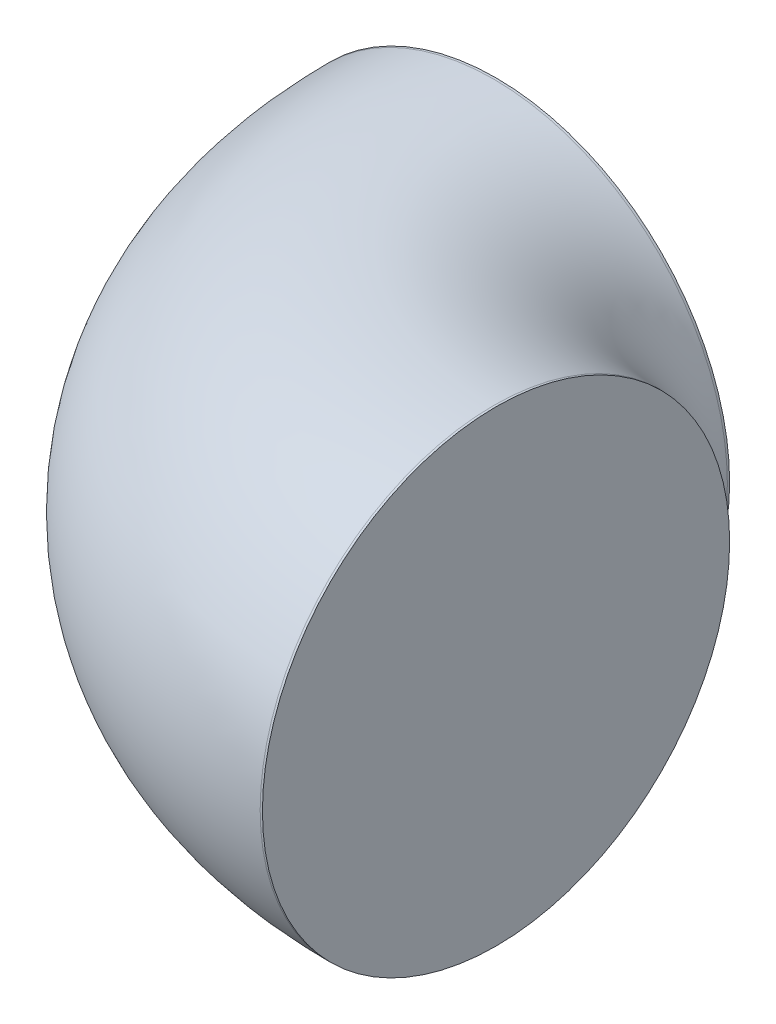
ISO-10303-21;
HEADER;
FILE_DESCRIPTION(('STEP AP214'),'2;1');
FILE_NAME('part.step','',(''),(''),'','','');
FILE_SCHEMA(('AUTOMOTIVE_DESIGN { 1 0 10303 214 1 1 1 1 }'));
ENDSEC;
DATA;
#1=APPLICATION_CONTEXT('core data for automotive mechanical design processes');
#2=APPLICATION_PROTOCOL_DEFINITION('international standard','automotive_design',2000,#1);
#3=PRODUCT_CONTEXT('',#1,'mechanical');
#4=PRODUCT('Part','Part','',(#3));
#5=PRODUCT_RELATED_PRODUCT_CATEGORY('part','',(#4));
#6=PRODUCT_DEFINITION_FORMATION('','',#4);
#7=PRODUCT_DEFINITION_CONTEXT('part definition',#1,'design');
#8=PRODUCT_DEFINITION('design','',#6,#7);
#9=PRODUCT_DEFINITION_SHAPE('','',#8);
#10=(LENGTH_UNIT() NAMED_UNIT(*) SI_UNIT(.MILLI.,.METRE.));
#11=(NAMED_UNIT(*) PLANE_ANGLE_UNIT() SI_UNIT($,.RADIAN.));
#12=(NAMED_UNIT(*) SI_UNIT($,.STERADIAN.) SOLID_ANGLE_UNIT());
#13=UNCERTAINTY_MEASURE_WITH_UNIT(LENGTH_MEASURE(1.E-05),#10,'distance_accuracy_value','');
#14=(GEOMETRIC_REPRESENTATION_CONTEXT(3) GLOBAL_UNCERTAINTY_ASSIGNED_CONTEXT((#13)) GLOBAL_UNIT_ASSIGNED_CONTEXT((#10,
#11,#12)) REPRESENTATION_CONTEXT('',''));
#15=CARTESIAN_POINT('',(0.,0.,0.));
#16=DIRECTION('',(0.,0.,1.));
#17=DIRECTION('',(1.,0.,0.));
#18=AXIS2_PLACEMENT_3D('',#15,#16,#17);
#19=CARTESIAN_POINT('',(-58.0614095716506,0.,-23.2688918307732));
#20=DIRECTION('',(0.,0.,-1.));
#21=DIRECTION('',(-1.,0.,0.));
#22=AXIS2_PLACEMENT_3D('',#19,#20,#21);
#23=PLANE('',#22);
#24=CARTESIAN_POINT('',(-58.0614095716506,0.,-23.2688918307732));
#25=DIRECTION('',(0.,0.,-1.));
#26=DIRECTION('',(-1.,0.,0.));
#27=AXIS2_PLACEMENT_3D('',#24,#25,#26);
#28=CIRCLE('',#27,26.25);
#29=CARTESIAN_POINT('',(-84.3114095716506,0.,-23.2688918307752));
#30=VERTEX_POINT('',#29);
#31=EDGE_CURVE('E57',#30,#30,#28,.T.);
#32=ORIENTED_EDGE('',*,*,#31,.T.);
#33=EDGE_LOOP('',(#32));
#34=FACE_BOUND('',#33,.T.);
#35=ADVANCED_FACE('F45',(#34),#23,.T.);
#36=CARTESIAN_POINT('',(-26.0574095716506,0.,8.73510816922678));
#37=DIRECTION('',(-1.,0.,0.));
#38=DIRECTION('',(0.,0.,1.));
#39=AXIS2_PLACEMENT_3D('',#36,#37,#38);
#40=PLANE('',#39);
#41=CARTESIAN_POINT('',(-26.0574095716506,0.,8.73510816922678));
#42=DIRECTION('',(-1.,0.,0.));
#43=DIRECTION('',(0.,0.,1.));
#44=AXIS2_PLACEMENT_3D('',#41,#42,#43);
#45=CIRCLE('',#44,26.25);
#46=CARTESIAN_POINT('',(-26.0574095716512,0.,34.9851081692268));
#47=VERTEX_POINT('',#46);
#48=EDGE_CURVE('E12',#47,#47,#45,.T.);
#49=ORIENTED_EDGE('',*,*,#48,.F.);
#50=EDGE_LOOP('',(#49));
#51=FACE_BOUND('',#50,.T.);
#52=ADVANCED_FACE('F63',(#51),#40,.F.);
#53=CARTESIAN_POINT('',(-58.0614095716506,0.,-23.2688918307732));
#54=DIRECTION('',(0.,0.,1.));
#55=DIRECTION('',(1.,0.,0.));
#56=AXIS2_PLACEMENT_3D('',#53,#54,#55);
#57=CYLINDRICAL_SURFACE('',#56,26.25);
#58=CARTESIAN_POINT('',(-58.0614095716507,0.,-23.0148918307732));
#59=DIRECTION('',(0.,0.,-1.));
#60=DIRECTION('',(-1.,0.,0.));
#61=AXIS2_PLACEMENT_3D('',#58,#59,#60);
#62=CIRCLE('',#61,26.25);
#63=CARTESIAN_POINT('',(-84.3114095716506,0.,-23.0148918307732));
#64=VERTEX_POINT('',#63);
#65=EDGE_CURVE('E88',#64,#64,#62,.T.);
#66=ORIENTED_EDGE('',*,*,#65,.T.);
#67=EDGE_LOOP('',(#66));
#68=FACE_BOUND('',#67,.T.);
#69=ORIENTED_EDGE('',*,*,#31,.F.);
#70=EDGE_LOOP('',(#69));
#71=FACE_BOUND('',#70,.T.);
#72=ADVANCED_FACE('F65',(#68,#71),#57,.T.);
#73=CARTESIAN_POINT('',(-26.3114095716506,0.,-23.0148918307732));
#74=DIRECTION('',(0.,1.,0.));
#75=DIRECTION('',(0.,0.,1.));
#76=AXIS2_PLACEMENT_3D('',#73,#74,#75);
#77=TOROIDAL_SURFACE('',#76,31.75,26.25);
#78=CARTESIAN_POINT('',(-26.3114095716509,0.,8.73510816922607));
#79=DIRECTION('',(-1.,0.,0.));
#80=DIRECTION('',(0.,0.,1.));
#81=AXIS2_PLACEMENT_3D('',#78,#79,#80);
#82=CIRCLE('',#81,26.25);
#83=CARTESIAN_POINT('',(-26.3114095716511,0.,34.9851081692268));
#84=VERTEX_POINT('',#83);
#85=EDGE_CURVE('E52',#84,#84,#82,.T.);
#86=CARTESIAN_POINT('',(-26.3114095716506,0.,-23.0148918307732));
#87=DIRECTION('',(0.,1.,0.));
#88=DIRECTION('',(0.,0.,1.));
#89=AXIS2_PLACEMENT_3D('',#86,#87,#88);
#90=CIRCLE('',#89,58.);
#91=EDGE_CURVE('',#64,#84,#90,.T.);
#92=ORIENTED_EDGE('',*,*,#65,.F.);
#93=ORIENTED_EDGE('',*,*,#85,.T.);
#94=ORIENTED_EDGE('',*,*,#91,.T.);
#95=ORIENTED_EDGE('',*,*,#91,.F.);
#96=EDGE_LOOP('',(#92,#94,#93,#95));
#97=FACE_BOUND('',#96,.T.);
#98=ADVANCED_FACE('F70',(#97),#77,.T.);
#99=CARTESIAN_POINT('',(-26.3114095716506,0.,8.73510816922677));
#100=DIRECTION('',(1.,0.,0.));
#101=DIRECTION('',(0.,0.,-1.));
#102=AXIS2_PLACEMENT_3D('',#99,#100,#101);
#103=CYLINDRICAL_SURFACE('',#102,26.25);
#104=ORIENTED_EDGE('',*,*,#48,.T.);
#105=EDGE_LOOP('',(#104));
#106=FACE_BOUND('',#105,.T.);
#107=ORIENTED_EDGE('',*,*,#85,.F.);
#108=EDGE_LOOP('',(#107));
#109=FACE_BOUND('',#108,.T.);
#110=ADVANCED_FACE('F60',(#106,#109),#103,.T.);
#111=CLOSED_SHELL('',(#35,#52,#72,#98,#110));
#112=MANIFOLD_SOLID_BREP('B2',#111);
#113=ADVANCED_BREP_SHAPE_REPRESENTATION('',(#18,#112),#14);
#114=SHAPE_DEFINITION_REPRESENTATION(#9,#113);
ENDSEC;
END-ISO-10303-21;
